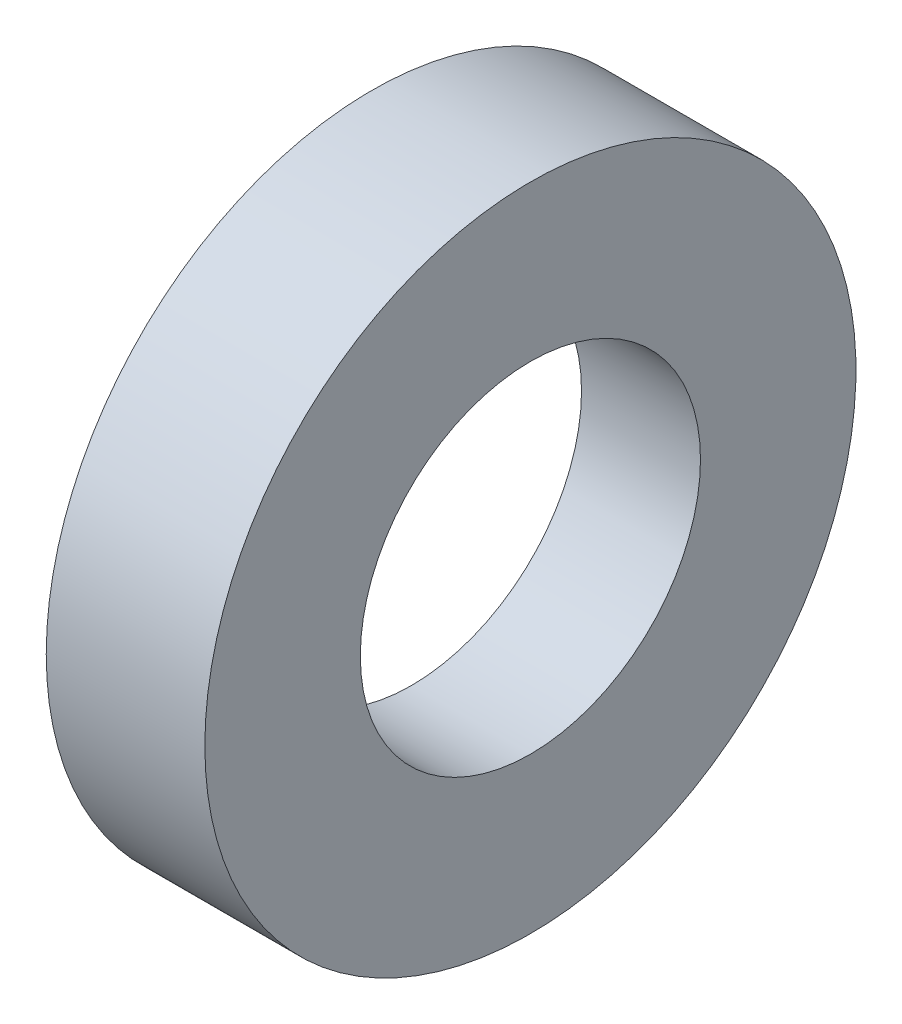
ISO-10303-21;
HEADER;
FILE_DESCRIPTION(('STEP AP214'),'2;1');
FILE_NAME('part.step','',(''),(''),'','','');
FILE_SCHEMA(('AUTOMOTIVE_DESIGN { 1 0 10303 214 1 1 1 1 }'));
ENDSEC;
DATA;
#1=APPLICATION_CONTEXT('core data for automotive mechanical design processes');
#2=APPLICATION_PROTOCOL_DEFINITION('international standard','automotive_design',2000,#1);
#3=PRODUCT_CONTEXT('',#1,'mechanical');
#4=PRODUCT('Part','Part','',(#3));
#5=PRODUCT_RELATED_PRODUCT_CATEGORY('part','',(#4));
#6=PRODUCT_DEFINITION_FORMATION('','',#4);
#7=PRODUCT_DEFINITION_CONTEXT('part definition',#1,'design');
#8=PRODUCT_DEFINITION('design','',#6,#7);
#9=PRODUCT_DEFINITION_SHAPE('','',#8);
#10=(LENGTH_UNIT() NAMED_UNIT(*) SI_UNIT(.MILLI.,.METRE.));
#11=(NAMED_UNIT(*) PLANE_ANGLE_UNIT() SI_UNIT($,.RADIAN.));
#12=(NAMED_UNIT(*) SI_UNIT($,.STERADIAN.) SOLID_ANGLE_UNIT());
#13=UNCERTAINTY_MEASURE_WITH_UNIT(LENGTH_MEASURE(1.E-05),#10,'distance_accuracy_value','');
#14=(GEOMETRIC_REPRESENTATION_CONTEXT(3) GLOBAL_UNCERTAINTY_ASSIGNED_CONTEXT((#13)) GLOBAL_UNIT_ASSIGNED_CONTEXT((#10,
#11,#12)) REPRESENTATION_CONTEXT('',''));
#15=CARTESIAN_POINT('',(0.,0.,0.));
#16=DIRECTION('',(0.,0.,1.));
#17=DIRECTION('',(1.,0.,0.));
#18=AXIS2_PLACEMENT_3D('',#15,#16,#17);
#19=CARTESIAN_POINT('',(-5.67836734693878,22.3,0.));
#20=DIRECTION('',(1.,0.,0.));
#21=DIRECTION('',(0.,0.,-1.));
#22=AXIS2_PLACEMENT_3D('',#19,#20,#21);
#23=PLANE('',#22);
#24=CARTESIAN_POINT('',(-5.67836734693878,0.,0.));
#25=DIRECTION('',(-1.,0.,0.));
#26=DIRECTION('',(0.,0.,1.));
#27=AXIS2_PLACEMENT_3D('',#24,#25,#26);
#28=CIRCLE('',#27,16.3);
#29=CARTESIAN_POINT('',(-5.67836734693878,0.,16.3));
#30=VERTEX_POINT('',#29);
#31=EDGE_CURVE('E10',#30,#30,#28,.T.);
#32=ORIENTED_EDGE('',*,*,#31,.F.);
#33=EDGE_LOOP('',(#32));
#34=FACE_BOUND('',#33,.T.);
#35=CARTESIAN_POINT('',(-5.67836734693878,0.,0.));
#36=DIRECTION('',(-1.,0.,0.));
#37=DIRECTION('',(0.,0.,1.));
#38=AXIS2_PLACEMENT_3D('',#35,#36,#37);
#39=CIRCLE('',#38,22.3);
#40=CARTESIAN_POINT('',(-5.67836734693878,0.,22.3));
#41=VERTEX_POINT('',#40);
#42=EDGE_CURVE('E66',#41,#41,#39,.T.);
#43=ORIENTED_EDGE('',*,*,#42,.T.);
#44=EDGE_LOOP('',(#43));
#45=FACE_BOUND('',#44,.T.);
#46=ADVANCED_FACE('F39',(#34,#45),#23,.F.);
#47=CARTESIAN_POINT('',(0.,0.,0.));
#48=DIRECTION('',(-1.,0.,0.));
#49=DIRECTION('',(0.,0.,1.));
#50=AXIS2_PLACEMENT_3D('',#47,#48,#49);
#51=CYLINDRICAL_SURFACE('',#50,16.3);
#52=CARTESIAN_POINT('',(5.72163265306122,0.,0.));
#53=DIRECTION('',(-1.,0.,0.));
#54=DIRECTION('',(0.,0.,1.));
#55=AXIS2_PLACEMENT_3D('',#52,#53,#54);
#56=CIRCLE('',#55,16.3);
#57=CARTESIAN_POINT('',(5.72163265306122,0.,16.3));
#58=VERTEX_POINT('',#57);
#59=EDGE_CURVE('E46',#58,#58,#56,.T.);
#60=ORIENTED_EDGE('',*,*,#59,.F.);
#61=EDGE_LOOP('',(#60));
#62=FACE_BOUND('',#61,.T.);
#63=ORIENTED_EDGE('',*,*,#31,.T.);
#64=EDGE_LOOP('',(#63));
#65=FACE_BOUND('',#64,.T.);
#66=ADVANCED_FACE('F92',(#62,#65),#51,.F.);
#67=CARTESIAN_POINT('',(5.72163265306122,16.3,0.));
#68=DIRECTION('',(-1.,0.,0.));
#69=DIRECTION('',(0.,0.,1.));
#70=AXIS2_PLACEMENT_3D('',#67,#68,#69);
#71=PLANE('',#70);
#72=CARTESIAN_POINT('',(5.72163265306122,0.,0.));
#73=DIRECTION('',(-1.,0.,0.));
#74=DIRECTION('',(0.,0.,1.));
#75=AXIS2_PLACEMENT_3D('',#72,#73,#74);
#76=CIRCLE('',#75,31.2);
#77=CARTESIAN_POINT('',(5.72163265306122,0.,31.2));
#78=VERTEX_POINT('',#77);
#79=EDGE_CURVE('E51',#78,#78,#76,.T.);
#80=ORIENTED_EDGE('',*,*,#79,.F.);
#81=EDGE_LOOP('',(#80));
#82=FACE_BOUND('',#81,.T.);
#83=ORIENTED_EDGE('',*,*,#59,.T.);
#84=EDGE_LOOP('',(#83));
#85=FACE_BOUND('',#84,.T.);
#86=ADVANCED_FACE('F87',(#82,#85),#71,.F.);
#87=CARTESIAN_POINT('',(0.,0.,0.));
#88=DIRECTION('',(-1.,0.,0.));
#89=DIRECTION('',(0.,0.,1.));
#90=AXIS2_PLACEMENT_3D('',#87,#88,#89);
#91=CYLINDRICAL_SURFACE('',#90,31.2);
#92=CARTESIAN_POINT('',(-9.47836734693878,0.,0.));
#93=DIRECTION('',(-1.,0.,0.));
#94=DIRECTION('',(0.,0.,1.));
#95=AXIS2_PLACEMENT_3D('',#92,#93,#94);
#96=CIRCLE('',#95,31.2);
#97=CARTESIAN_POINT('',(-9.47836734693878,0.,31.2));
#98=VERTEX_POINT('',#97);
#99=EDGE_CURVE('E56',#98,#98,#96,.T.);
#100=ORIENTED_EDGE('',*,*,#99,.F.);
#101=EDGE_LOOP('',(#100));
#102=FACE_BOUND('',#101,.T.);
#103=ORIENTED_EDGE('',*,*,#79,.T.);
#104=EDGE_LOOP('',(#103));
#105=FACE_BOUND('',#104,.T.);
#106=ADVANCED_FACE('F81',(#102,#105),#91,.T.);
#107=CARTESIAN_POINT('',(-9.47836734693878,31.2,0.));
#108=DIRECTION('',(1.,0.,0.));
#109=DIRECTION('',(0.,0.,-1.));
#110=AXIS2_PLACEMENT_3D('',#107,#108,#109);
#111=PLANE('',#110);
#112=CARTESIAN_POINT('',(-9.47836734693878,0.,0.));
#113=DIRECTION('',(-1.,0.,0.));
#114=DIRECTION('',(0.,0.,1.));
#115=AXIS2_PLACEMENT_3D('',#112,#113,#114);
#116=CIRCLE('',#115,22.3);
#117=CARTESIAN_POINT('',(-9.47836734693878,0.,22.3));
#118=VERTEX_POINT('',#117);
#119=EDGE_CURVE('E62',#118,#118,#116,.T.);
#120=ORIENTED_EDGE('',*,*,#119,.F.);
#121=EDGE_LOOP('',(#120));
#122=FACE_BOUND('',#121,.T.);
#123=ORIENTED_EDGE('',*,*,#99,.T.);
#124=EDGE_LOOP('',(#123));
#125=FACE_BOUND('',#124,.T.);
#126=ADVANCED_FACE('F75',(#122,#125),#111,.F.);
#127=CARTESIAN_POINT('',(0.,0.,0.));
#128=DIRECTION('',(-1.,0.,0.));
#129=DIRECTION('',(0.,0.,1.));
#130=AXIS2_PLACEMENT_3D('',#127,#128,#129);
#131=CYLINDRICAL_SURFACE('',#130,22.3);
#132=ORIENTED_EDGE('',*,*,#42,.F.);
#133=EDGE_LOOP('',(#132));
#134=FACE_BOUND('',#133,.T.);
#135=ORIENTED_EDGE('',*,*,#119,.T.);
#136=EDGE_LOOP('',(#135));
#137=FACE_BOUND('',#136,.T.);
#138=ADVANCED_FACE('F72',(#134,#137),#131,.F.);
#139=CLOSED_SHELL('',(#46,#66,#86,#106,#126,#138));
#140=MANIFOLD_SOLID_BREP('B2',#139);
#141=ADVANCED_BREP_SHAPE_REPRESENTATION('',(#18,#140),#14);
#142=SHAPE_DEFINITION_REPRESENTATION(#9,#141);
ENDSEC;
END-ISO-10303-21;
